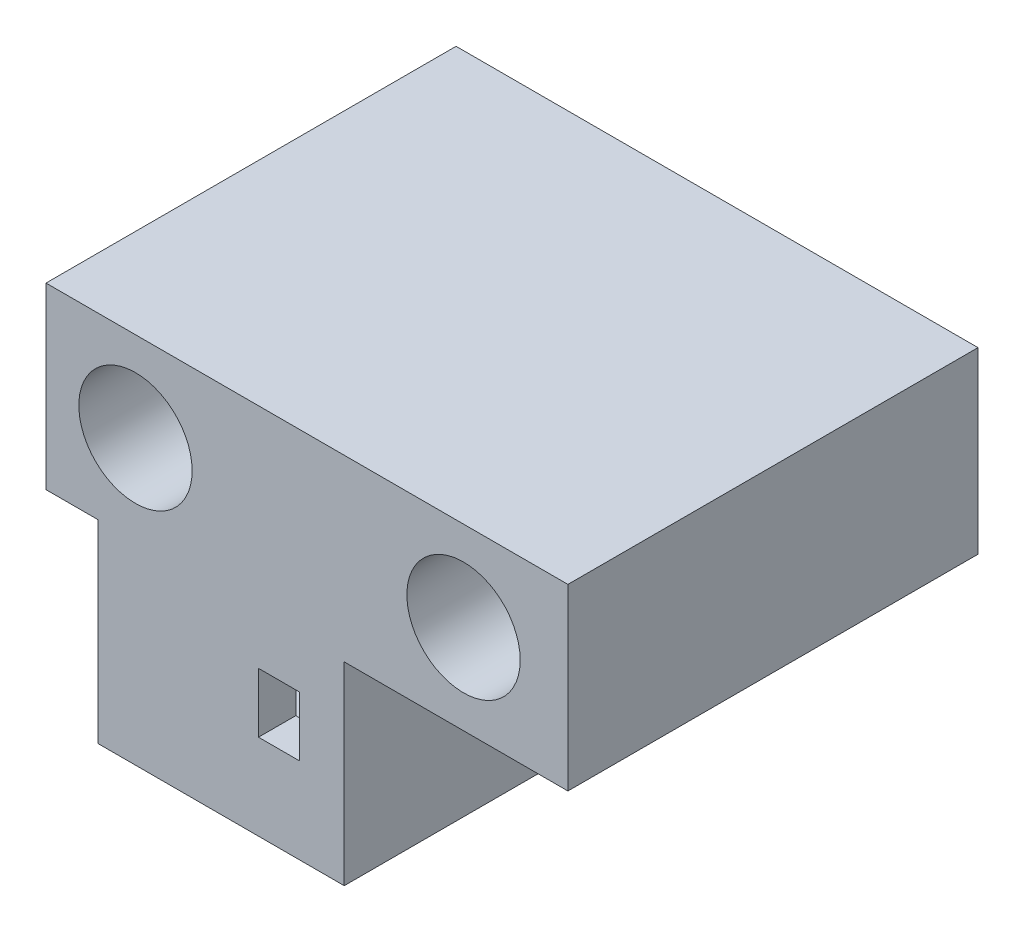
ISO-10303-21;
HEADER;
FILE_DESCRIPTION(('STEP AP214'),'2;1');
FILE_NAME('part.step','',(''),(''),'','','');
FILE_SCHEMA(('AUTOMOTIVE_DESIGN { 1 0 10303 214 1 1 1 1 }'));
ENDSEC;
DATA;
#1=APPLICATION_CONTEXT('core data for automotive mechanical design processes');
#2=APPLICATION_PROTOCOL_DEFINITION('international standard','automotive_design',2000,#1);
#3=PRODUCT_CONTEXT('',#1,'mechanical');
#4=PRODUCT('Part','Part','',(#3));
#5=PRODUCT_RELATED_PRODUCT_CATEGORY('part','',(#4));
#6=PRODUCT_DEFINITION_FORMATION('','',#4);
#7=PRODUCT_DEFINITION_CONTEXT('part definition',#1,'design');
#8=PRODUCT_DEFINITION('design','',#6,#7);
#9=PRODUCT_DEFINITION_SHAPE('','',#8);
#10=(LENGTH_UNIT() NAMED_UNIT(*) SI_UNIT(.MILLI.,.METRE.));
#11=(NAMED_UNIT(*) PLANE_ANGLE_UNIT() SI_UNIT($,.RADIAN.));
#12=(NAMED_UNIT(*) SI_UNIT($,.STERADIAN.) SOLID_ANGLE_UNIT());
#13=UNCERTAINTY_MEASURE_WITH_UNIT(LENGTH_MEASURE(1.E-05),#10,'distance_accuracy_value','');
#14=(GEOMETRIC_REPRESENTATION_CONTEXT(3) GLOBAL_UNCERTAINTY_ASSIGNED_CONTEXT((#13)) GLOBAL_UNIT_ASSIGNED_CONTEXT((#10,
#11,#12)) REPRESENTATION_CONTEXT('',''));
#15=CARTESIAN_POINT('',(0.,0.,0.));
#16=DIRECTION('',(0.,0.,1.));
#17=DIRECTION('',(1.,0.,0.));
#18=AXIS2_PLACEMENT_3D('',#15,#16,#17);
#19=CARTESIAN_POINT('',(0.,0.,55.));
#20=DIRECTION('',(0.,1.,0.));
#21=DIRECTION('',(0.,0.,1.));
#22=AXIS2_PLACEMENT_3D('',#19,#20,#21);
#23=PLANE('',#22);
#24=DIRECTION('',(0.,0.,-1.));
#25=VECTOR('',#24,1.);
#26=CARTESIAN_POINT('',(7.,0.,0.));
#27=LINE('',#26,#25);
#28=CARTESIAN_POINT('',(7.,0.,5.));
#29=VERTEX_POINT('',#28);
#30=CARTESIAN_POINT('',(7.,0.,0.));
#31=VERTEX_POINT('',#30);
#32=EDGE_CURVE('E211',#29,#31,#27,.T.);
#33=ORIENTED_EDGE('',*,*,#32,.F.);
#34=DIRECTION('',(-1.,0.,0.));
#35=VECTOR('',#34,1.);
#36=CARTESIAN_POINT('',(7.,0.,5.));
#37=LINE('',#36,#35);
#38=CARTESIAN_POINT('',(35.,0.,5.));
#39=VERTEX_POINT('',#38);
#40=EDGE_CURVE('E218',#39,#29,#37,.T.);
#41=ORIENTED_EDGE('',*,*,#40,.F.);
#42=DIRECTION('',(0.,0.,-1.));
#43=VECTOR('',#42,1.);
#44=CARTESIAN_POINT('',(35.,0.,5.));
#45=LINE('',#44,#43);
#46=CARTESIAN_POINT('',(35.,0.,50.));
#47=VERTEX_POINT('',#46);
#48=EDGE_CURVE('E236',#47,#39,#45,.T.);
#49=ORIENTED_EDGE('',*,*,#48,.F.);
#50=DIRECTION('',(1.,0.,0.));
#51=VECTOR('',#50,1.);
#52=CARTESIAN_POINT('',(7.,0.,50.));
#53=LINE('',#52,#51);
#54=CARTESIAN_POINT('',(7.,0.,50.));
#55=VERTEX_POINT('',#54);
#56=EDGE_CURVE('E233',#55,#47,#53,.T.);
#57=ORIENTED_EDGE('',*,*,#56,.F.);
#58=DIRECTION('',(0.,0.,-1.));
#59=VECTOR('',#58,1.);
#60=CARTESIAN_POINT('',(7.,0.,55.));
#61=LINE('',#60,#59);
#62=CARTESIAN_POINT('',(7.,0.,55.));
#63=VERTEX_POINT('',#62);
#64=EDGE_CURVE('E230',#63,#55,#61,.T.);
#65=ORIENTED_EDGE('',*,*,#64,.F.);
#66=DIRECTION('',(1.,0.,0.));
#67=VECTOR('',#66,1.);
#68=CARTESIAN_POINT('',(0.,0.,55.));
#69=LINE('',#68,#67);
#70=CARTESIAN_POINT('',(0.,0.,55.));
#71=VERTEX_POINT('',#70);
#72=EDGE_CURVE('E282',#71,#63,#69,.T.);
#73=ORIENTED_EDGE('',*,*,#72,.F.);
#74=DIRECTION('',(0.,0.,-1.));
#75=VECTOR('',#74,1.);
#76=CARTESIAN_POINT('',(0.,0.,55.));
#77=LINE('',#76,#75);
#78=CARTESIAN_POINT('',(0.,0.,0.));
#79=VERTEX_POINT('',#78);
#80=EDGE_CURVE('E306',#71,#79,#77,.T.);
#81=ORIENTED_EDGE('',*,*,#80,.T.);
#82=DIRECTION('',(1.,0.,0.));
#83=VECTOR('',#82,1.);
#84=CARTESIAN_POINT('',(0.,0.,0.));
#85=LINE('',#84,#83);
#86=EDGE_CURVE('E293',#79,#31,#85,.T.);
#87=ORIENTED_EDGE('',*,*,#86,.T.);
#88=EDGE_LOOP('',(#33,#41,#49,#57,#65,#73,#81,#87));
#89=FACE_BOUND('',#88,.T.);
#90=ADVANCED_FACE('F33',(#89),#23,.F.);
#91=DIRECTION('',(0.,0.,1.));
#92=VECTOR('',#91,1.);
#93=CARTESIAN_POINT('',(40.,0.,0.));
#94=LINE('',#93,#92);
#95=CARTESIAN_POINT('',(40.,0.,0.));
#96=VERTEX_POINT('',#95);
#97=CARTESIAN_POINT('',(40.,0.,55.));
#98=VERTEX_POINT('',#97);
#99=EDGE_CURVE('E227',#96,#98,#94,.T.);
#100=ORIENTED_EDGE('',*,*,#99,.F.);
#101=CARTESIAN_POINT('',(70.,0.,0.));
#102=VERTEX_POINT('',#101);
#103=EDGE_CURVE('E292',#96,#102,#85,.T.);
#104=ORIENTED_EDGE('',*,*,#103,.T.);
#105=DIRECTION('',(0.,0.,-1.));
#106=VECTOR('',#105,1.);
#107=CARTESIAN_POINT('',(70.,0.,55.));
#108=LINE('',#107,#106);
#109=CARTESIAN_POINT('',(70.,0.,55.));
#110=VERTEX_POINT('',#109);
#111=EDGE_CURVE('E303',#110,#102,#108,.T.);
#112=ORIENTED_EDGE('',*,*,#111,.F.);
#113=EDGE_CURVE('E280',#98,#110,#69,.T.);
#114=ORIENTED_EDGE('',*,*,#113,.F.);
#115=EDGE_LOOP('',(#100,#104,#112,#114));
#116=FACE_BOUND('',#115,.T.);
#117=ADVANCED_FACE('F332',(#116),#23,.F.);
#118=CARTESIAN_POINT('',(0.,0.,55.));
#119=DIRECTION('',(1.,0.,0.));
#120=DIRECTION('',(0.,0.,-1.));
#121=AXIS2_PLACEMENT_3D('',#118,#119,#120);
#122=PLANE('',#121);
#123=DIRECTION('',(0.,-1.,0.));
#124=VECTOR('',#123,1.);
#125=CARTESIAN_POINT('',(0.,0.,0.));
#126=LINE('',#125,#124);
#127=CARTESIAN_POINT('',(0.,24.,0.));
#128=VERTEX_POINT('',#127);
#129=EDGE_CURVE('E274',#128,#79,#126,.T.);
#130=ORIENTED_EDGE('',*,*,#129,.T.);
#131=ORIENTED_EDGE('',*,*,#80,.F.);
#132=DIRECTION('',(0.,-1.,0.));
#133=VECTOR('',#132,1.);
#134=CARTESIAN_POINT('',(0.,0.,55.));
#135=LINE('',#134,#133);
#136=CARTESIAN_POINT('',(0.,24.,55.));
#137=VERTEX_POINT('',#136);
#138=EDGE_CURVE('E277',#137,#71,#135,.T.);
#139=ORIENTED_EDGE('',*,*,#138,.F.);
#140=DIRECTION('',(0.,0.,-1.));
#141=VECTOR('',#140,1.);
#142=CARTESIAN_POINT('',(0.,24.,55.));
#143=LINE('',#142,#141);
#144=EDGE_CURVE('E289',#137,#128,#143,.T.);
#145=ORIENTED_EDGE('',*,*,#144,.T.);
#146=EDGE_LOOP('',(#130,#131,#139,#145));
#147=FACE_BOUND('',#146,.T.);
#148=ADVANCED_FACE('F35',(#147),#122,.F.);
#149=CARTESIAN_POINT('',(70.,0.,55.));
#150=DIRECTION('',(-1.,0.,0.));
#151=DIRECTION('',(0.,0.,1.));
#152=AXIS2_PLACEMENT_3D('',#149,#150,#151);
#153=PLANE('',#152);
#154=DIRECTION('',(0.,1.,0.));
#155=VECTOR('',#154,1.);
#156=CARTESIAN_POINT('',(70.,0.,0.));
#157=LINE('',#156,#155);
#158=CARTESIAN_POINT('',(70.,24.,0.));
#159=VERTEX_POINT('',#158);
#160=EDGE_CURVE('E295',#102,#159,#157,.T.);
#161=ORIENTED_EDGE('',*,*,#160,.T.);
#162=DIRECTION('',(0.,0.,-1.));
#163=VECTOR('',#162,1.);
#164=CARTESIAN_POINT('',(70.,24.,55.));
#165=LINE('',#164,#163);
#166=CARTESIAN_POINT('',(70.,24.,55.));
#167=VERTEX_POINT('',#166);
#168=EDGE_CURVE('E300',#167,#159,#165,.T.);
#169=ORIENTED_EDGE('',*,*,#168,.F.);
#170=DIRECTION('',(0.,1.,0.));
#171=VECTOR('',#170,1.);
#172=CARTESIAN_POINT('',(70.,0.,55.));
#173=LINE('',#172,#171);
#174=EDGE_CURVE('E285',#110,#167,#173,.T.);
#175=ORIENTED_EDGE('',*,*,#174,.F.);
#176=ORIENTED_EDGE('',*,*,#111,.T.);
#177=EDGE_LOOP('',(#161,#169,#175,#176));
#178=FACE_BOUND('',#177,.T.);
#179=ADVANCED_FACE('F339',(#178),#153,.F.);
#180=CARTESIAN_POINT('',(0.,24.,55.));
#181=DIRECTION('',(0.,-1.,0.));
#182=DIRECTION('',(0.,0.,-1.));
#183=AXIS2_PLACEMENT_3D('',#180,#181,#182);
#184=PLANE('',#183);
#185=DIRECTION('',(-1.,0.,0.));
#186=VECTOR('',#185,1.);
#187=CARTESIAN_POINT('',(0.,24.,0.));
#188=LINE('',#187,#186);
#189=EDGE_CURVE('E281',#159,#128,#188,.T.);
#190=ORIENTED_EDGE('',*,*,#189,.T.);
#191=ORIENTED_EDGE('',*,*,#144,.F.);
#192=DIRECTION('',(-1.,0.,0.));
#193=VECTOR('',#192,1.);
#194=CARTESIAN_POINT('',(0.,24.,55.));
#195=LINE('',#194,#193);
#196=EDGE_CURVE('E287',#167,#137,#195,.T.);
#197=ORIENTED_EDGE('',*,*,#196,.F.);
#198=ORIENTED_EDGE('',*,*,#168,.T.);
#199=EDGE_LOOP('',(#190,#191,#197,#198));
#200=FACE_BOUND('',#199,.T.);
#201=ADVANCED_FACE('F342',(#200),#184,.F.);
#202=CARTESIAN_POINT('',(0.,0.,55.));
#203=DIRECTION('',(0.,0.,-1.));
#204=DIRECTION('',(-1.,0.,0.));
#205=AXIS2_PLACEMENT_3D('',#202,#203,#204);
#206=PLANE('',#205);
#207=DIRECTION('',(1.,0.,0.));
#208=VECTOR('',#207,1.);
#209=CARTESIAN_POINT('',(28.5,-14.5,55.));
#210=LINE('',#209,#208);
#211=CARTESIAN_POINT('',(28.5,-14.5,55.));
#212=VERTEX_POINT('',#211);
#213=CARTESIAN_POINT('',(34.,-14.5,55.));
#214=VERTEX_POINT('',#213);
#215=EDGE_CURVE('E158',#212,#214,#210,.T.);
#216=ORIENTED_EDGE('',*,*,#215,.F.);
#217=DIRECTION('',(0.,-1.,0.));
#218=VECTOR('',#217,1.);
#219=CARTESIAN_POINT('',(28.5,-14.5,55.));
#220=LINE('',#219,#218);
#221=CARTESIAN_POINT('',(28.5,-6.5,55.));
#222=VERTEX_POINT('',#221);
#223=EDGE_CURVE('E48',#222,#212,#220,.T.);
#224=ORIENTED_EDGE('',*,*,#223,.F.);
#225=DIRECTION('',(-1.,0.,0.));
#226=VECTOR('',#225,1.);
#227=CARTESIAN_POINT('',(28.5,-6.5,55.));
#228=LINE('',#227,#226);
#229=CARTESIAN_POINT('',(34.,-6.5,55.));
#230=VERTEX_POINT('',#229);
#231=EDGE_CURVE('E165',#230,#222,#228,.T.);
#232=ORIENTED_EDGE('',*,*,#231,.F.);
#233=DIRECTION('',(0.,1.,0.));
#234=VECTOR('',#233,1.);
#235=CARTESIAN_POINT('',(34.,-14.5,55.));
#236=LINE('',#235,#234);
#237=EDGE_CURVE('E149',#214,#230,#236,.T.);
#238=ORIENTED_EDGE('',*,*,#237,.F.);
#239=EDGE_LOOP('',(#216,#224,#232,#238));
#240=FACE_BOUND('',#239,.T.);
#241=CARTESIAN_POINT('',(12.,12.,55.));
#242=DIRECTION('',(0.,0.,1.));
#243=DIRECTION('',(1.,0.,0.));
#244=AXIS2_PLACEMENT_3D('',#241,#242,#243);
#245=CIRCLE('',#244,7.6);
#246=CARTESIAN_POINT('',(19.6,12.,55.));
#247=VERTEX_POINT('',#246);
#248=EDGE_CURVE('E265',#247,#247,#245,.T.);
#249=ORIENTED_EDGE('',*,*,#248,.F.);
#250=EDGE_LOOP('',(#249));
#251=FACE_BOUND('',#250,.T.);
#252=CARTESIAN_POINT('',(56.,12.,55.));
#253=DIRECTION('',(0.,0.,1.));
#254=DIRECTION('',(1.,0.,0.));
#255=AXIS2_PLACEMENT_3D('',#252,#253,#254);
#256=CIRCLE('',#255,7.59999999999999);
#257=CARTESIAN_POINT('',(63.6,12.,55.));
#258=VERTEX_POINT('',#257);
#259=EDGE_CURVE('E271',#258,#258,#256,.T.);
#260=ORIENTED_EDGE('',*,*,#259,.F.);
#261=EDGE_LOOP('',(#260));
#262=FACE_BOUND('',#261,.T.);
#263=ORIENTED_EDGE('',*,*,#138,.T.);
#264=ORIENTED_EDGE('',*,*,#72,.T.);
#265=DIRECTION('',(0.,1.,0.));
#266=VECTOR('',#265,1.);
#267=CARTESIAN_POINT('',(7.,-21.,55.));
#268=LINE('',#267,#266);
#269=CARTESIAN_POINT('',(7.,-26.,55.));
#270=VERTEX_POINT('',#269);
#271=EDGE_CURVE('E252',#270,#63,#268,.T.);
#272=ORIENTED_EDGE('',*,*,#271,.F.);
#273=DIRECTION('',(-1.,0.,0.));
#274=VECTOR('',#273,1.);
#275=CARTESIAN_POINT('',(40.,-26.,55.));
#276=LINE('',#275,#274);
#277=CARTESIAN_POINT('',(40.,-26.,55.));
#278=VERTEX_POINT('',#277);
#279=EDGE_CURVE('E202',#278,#270,#276,.T.);
#280=ORIENTED_EDGE('',*,*,#279,.F.);
#281=DIRECTION('',(0.,1.,0.));
#282=VECTOR('',#281,1.);
#283=CARTESIAN_POINT('',(40.,-21.,55.));
#284=LINE('',#283,#282);
#285=EDGE_CURVE('E255',#278,#98,#284,.T.);
#286=ORIENTED_EDGE('',*,*,#285,.T.);
#287=ORIENTED_EDGE('',*,*,#113,.T.);
#288=ORIENTED_EDGE('',*,*,#174,.T.);
#289=ORIENTED_EDGE('',*,*,#196,.T.);
#290=EDGE_LOOP('',(#263,#264,#272,#280,#286,#287,#288,#289));
#291=FACE_BOUND('',#290,.T.);
#292=ADVANCED_FACE('F162',(#240,#251,#262,#291),#206,.F.);
#293=CARTESIAN_POINT('',(0.,0.,0.));
#294=DIRECTION('',(0.,0.,-1.));
#295=DIRECTION('',(-1.,0.,0.));
#296=AXIS2_PLACEMENT_3D('',#293,#294,#295);
#297=PLANE('',#296);
#298=CARTESIAN_POINT('',(12.,12.,0.));
#299=DIRECTION('',(0.,0.,1.));
#300=DIRECTION('',(1.,0.,0.));
#301=AXIS2_PLACEMENT_3D('',#298,#299,#300);
#302=CIRCLE('',#301,7.6);
#303=CARTESIAN_POINT('',(19.6,12.,0.));
#304=VERTEX_POINT('',#303);
#305=EDGE_CURVE('E264',#304,#304,#302,.T.);
#306=ORIENTED_EDGE('',*,*,#305,.T.);
#307=EDGE_LOOP('',(#306));
#308=FACE_BOUND('',#307,.T.);
#309=CARTESIAN_POINT('',(56.,12.,0.));
#310=DIRECTION('',(0.,0.,1.));
#311=DIRECTION('',(1.,0.,0.));
#312=AXIS2_PLACEMENT_3D('',#309,#310,#311);
#313=CIRCLE('',#312,7.59999999999999);
#314=CARTESIAN_POINT('',(63.6,12.,0.));
#315=VERTEX_POINT('',#314);
#316=EDGE_CURVE('E268',#315,#315,#313,.T.);
#317=ORIENTED_EDGE('',*,*,#316,.T.);
#318=EDGE_LOOP('',(#317));
#319=FACE_BOUND('',#318,.T.);
#320=ORIENTED_EDGE('',*,*,#129,.F.);
#321=ORIENTED_EDGE('',*,*,#189,.F.);
#322=ORIENTED_EDGE('',*,*,#160,.F.);
#323=ORIENTED_EDGE('',*,*,#103,.F.);
#324=DIRECTION('',(0.,1.,0.));
#325=VECTOR('',#324,1.);
#326=CARTESIAN_POINT('',(40.,-21.,0.));
#327=LINE('',#326,#325);
#328=CARTESIAN_POINT('',(40.,-26.,0.));
#329=VERTEX_POINT('',#328);
#330=EDGE_CURVE('E258',#329,#96,#327,.T.);
#331=ORIENTED_EDGE('',*,*,#330,.F.);
#332=DIRECTION('',(1.,0.,0.));
#333=VECTOR('',#332,1.);
#334=CARTESIAN_POINT('',(40.,-26.,0.));
#335=LINE('',#334,#333);
#336=CARTESIAN_POINT('',(7.,-26.,0.));
#337=VERTEX_POINT('',#336);
#338=EDGE_CURVE('E208',#337,#329,#335,.T.);
#339=ORIENTED_EDGE('',*,*,#338,.F.);
#340=DIRECTION('',(0.,1.,0.));
#341=VECTOR('',#340,1.);
#342=CARTESIAN_POINT('',(7.,-21.,0.));
#343=LINE('',#342,#341);
#344=EDGE_CURVE('E261',#337,#31,#343,.T.);
#345=ORIENTED_EDGE('',*,*,#344,.T.);
#346=ORIENTED_EDGE('',*,*,#86,.F.);
#347=EDGE_LOOP('',(#320,#321,#322,#323,#331,#339,#345,#346));
#348=FACE_BOUND('',#347,.T.);
#349=ADVANCED_FACE('F347',(#308,#319,#348),#297,.T.);
#350=CARTESIAN_POINT('',(56.,12.,55.));
#351=DIRECTION('',(0.,0.,-1.));
#352=DIRECTION('',(-1.,0.,0.));
#353=AXIS2_PLACEMENT_3D('',#350,#351,#352);
#354=CYLINDRICAL_SURFACE('',#353,7.59999999999999);
#355=ORIENTED_EDGE('',*,*,#259,.T.);
#356=EDGE_LOOP('',(#355));
#357=FACE_BOUND('',#356,.T.);
#358=ORIENTED_EDGE('',*,*,#316,.F.);
#359=EDGE_LOOP('',(#358));
#360=FACE_BOUND('',#359,.T.);
#361=ADVANCED_FACE('F350',(#357,#360),#354,.F.);
#362=CARTESIAN_POINT('',(12.,12.,55.));
#363=DIRECTION('',(0.,0.,-1.));
#364=DIRECTION('',(-1.,0.,0.));
#365=AXIS2_PLACEMENT_3D('',#362,#363,#364);
#366=CYLINDRICAL_SURFACE('',#365,7.6);
#367=ORIENTED_EDGE('',*,*,#248,.T.);
#368=EDGE_LOOP('',(#367));
#369=FACE_BOUND('',#368,.T.);
#370=ORIENTED_EDGE('',*,*,#305,.F.);
#371=EDGE_LOOP('',(#370));
#372=FACE_BOUND('',#371,.T.);
#373=ADVANCED_FACE('F356',(#369,#372),#366,.F.);
#374=CARTESIAN_POINT('',(7.,-21.,0.));
#375=DIRECTION('',(1.,0.,0.));
#376=DIRECTION('',(0.,0.,-1.));
#377=AXIS2_PLACEMENT_3D('',#374,#375,#376);
#378=PLANE('',#377);
#379=CARTESIAN_POINT('',(7.,-5.,52.5));
#380=DIRECTION('',(-1.,0.,0.));
#381=DIRECTION('',(0.,0.,1.));
#382=AXIS2_PLACEMENT_3D('',#379,#380,#381);
#383=CIRCLE('',#382,1.5);
#384=CARTESIAN_POINT('',(7.,-5.,54.));
#385=VERTEX_POINT('',#384);
#386=EDGE_CURVE('E179',#385,#385,#383,.T.);
#387=ORIENTED_EDGE('',*,*,#386,.F.);
#388=EDGE_LOOP('',(#387));
#389=FACE_BOUND('',#388,.T.);
#390=CARTESIAN_POINT('',(7.,-16.,2.5));
#391=DIRECTION('',(-1.,0.,0.));
#392=DIRECTION('',(0.,0.,1.));
#393=AXIS2_PLACEMENT_3D('',#390,#391,#392);
#394=CIRCLE('',#393,1.5);
#395=CARTESIAN_POINT('',(7.,-16.,4.));
#396=VERTEX_POINT('',#395);
#397=EDGE_CURVE('E185',#396,#396,#394,.T.);
#398=ORIENTED_EDGE('',*,*,#397,.F.);
#399=EDGE_LOOP('',(#398));
#400=FACE_BOUND('',#399,.T.);
#401=CARTESIAN_POINT('',(7.,-5.,2.5));
#402=DIRECTION('',(-1.,0.,0.));
#403=DIRECTION('',(0.,0.,1.));
#404=AXIS2_PLACEMENT_3D('',#401,#402,#403);
#405=CIRCLE('',#404,1.5);
#406=CARTESIAN_POINT('',(7.,-5.,4.));
#407=VERTEX_POINT('',#406);
#408=EDGE_CURVE('E172',#407,#407,#405,.T.);
#409=ORIENTED_EDGE('',*,*,#408,.F.);
#410=EDGE_LOOP('',(#409));
#411=FACE_BOUND('',#410,.T.);
#412=CARTESIAN_POINT('',(7.,-16.,52.5));
#413=DIRECTION('',(-1.,0.,0.));
#414=DIRECTION('',(0.,0.,1.));
#415=AXIS2_PLACEMENT_3D('',#412,#413,#414);
#416=CIRCLE('',#415,1.5);
#417=CARTESIAN_POINT('',(7.,-16.,54.));
#418=VERTEX_POINT('',#417);
#419=EDGE_CURVE('E178',#418,#418,#416,.T.);
#420=ORIENTED_EDGE('',*,*,#419,.F.);
#421=EDGE_LOOP('',(#420));
#422=FACE_BOUND('',#421,.T.);
#423=ORIENTED_EDGE('',*,*,#32,.T.);
#424=ORIENTED_EDGE('',*,*,#344,.F.);
#425=DIRECTION('',(0.,0.,-1.));
#426=VECTOR('',#425,1.);
#427=CARTESIAN_POINT('',(7.,-26.,55.));
#428=LINE('',#427,#426);
#429=EDGE_CURVE('E205',#270,#337,#428,.T.);
#430=ORIENTED_EDGE('',*,*,#429,.F.);
#431=ORIENTED_EDGE('',*,*,#271,.T.);
#432=ORIENTED_EDGE('',*,*,#64,.T.);
#433=DIRECTION('',(0.,1.,0.));
#434=VECTOR('',#433,1.);
#435=CARTESIAN_POINT('',(7.,-21.,50.));
#436=LINE('',#435,#434);
#437=CARTESIAN_POINT('',(7.,-21.,50.));
#438=VERTEX_POINT('',#437);
#439=EDGE_CURVE('E249',#438,#55,#436,.T.);
#440=ORIENTED_EDGE('',*,*,#439,.F.);
#441=DIRECTION('',(0.,0.,-1.));
#442=VECTOR('',#441,1.);
#443=CARTESIAN_POINT('',(7.,-21.,55.));
#444=LINE('',#443,#442);
#445=CARTESIAN_POINT('',(7.,-21.,5.));
#446=VERTEX_POINT('',#445);
#447=EDGE_CURVE('E196',#438,#446,#444,.T.);
#448=ORIENTED_EDGE('',*,*,#447,.T.);
#449=DIRECTION('',(0.,1.,0.));
#450=VECTOR('',#449,1.);
#451=CARTESIAN_POINT('',(7.,-21.,5.));
#452=LINE('',#451,#450);
#453=EDGE_CURVE('E224',#446,#29,#452,.T.);
#454=ORIENTED_EDGE('',*,*,#453,.T.);
#455=EDGE_LOOP('',(#423,#424,#430,#431,#432,#440,#448,#454));
#456=FACE_BOUND('',#455,.T.);
#457=ADVANCED_FACE('F360',(#389,#400,#411,#422,#456),#378,.F.);
#458=CARTESIAN_POINT('',(40.,-21.,0.));
#459=DIRECTION('',(-1.,0.,0.));
#460=DIRECTION('',(0.,0.,1.));
#461=AXIS2_PLACEMENT_3D('',#458,#459,#460);
#462=PLANE('',#461);
#463=ORIENTED_EDGE('',*,*,#99,.T.);
#464=ORIENTED_EDGE('',*,*,#285,.F.);
#465=DIRECTION('',(0.,0.,1.));
#466=VECTOR('',#465,1.);
#467=CARTESIAN_POINT('',(40.,-26.,55.));
#468=LINE('',#467,#466);
#469=EDGE_CURVE('E199',#329,#278,#468,.T.);
#470=ORIENTED_EDGE('',*,*,#469,.F.);
#471=ORIENTED_EDGE('',*,*,#330,.T.);
#472=EDGE_LOOP('',(#463,#464,#470,#471));
#473=FACE_BOUND('',#472,.T.);
#474=ADVANCED_FACE('F364',(#473),#462,.F.);
#475=CARTESIAN_POINT('',(7.,-21.,50.));
#476=DIRECTION('',(0.,0.,1.));
#477=DIRECTION('',(1.,0.,0.));
#478=AXIS2_PLACEMENT_3D('',#475,#476,#477);
#479=PLANE('',#478);
#480=DIRECTION('',(-1.,0.,0.));
#481=VECTOR('',#480,1.);
#482=CARTESIAN_POINT('',(6.99999999999999,-6.50000000000002,50.));
#483=LINE('',#482,#481);
#484=CARTESIAN_POINT('',(34.,-6.5,50.));
#485=VERTEX_POINT('',#484);
#486=CARTESIAN_POINT('',(28.5,-6.5,50.));
#487=VERTEX_POINT('',#486);
#488=EDGE_CURVE('E41',#485,#487,#483,.T.);
#489=ORIENTED_EDGE('',*,*,#488,.T.);
#490=DIRECTION('',(0.,-1.,0.));
#491=VECTOR('',#490,1.);
#492=CARTESIAN_POINT('',(28.5,-21.,50.));
#493=LINE('',#492,#491);
#494=CARTESIAN_POINT('',(28.5,-14.5,50.));
#495=VERTEX_POINT('',#494);
#496=EDGE_CURVE('E11',#487,#495,#493,.T.);
#497=ORIENTED_EDGE('',*,*,#496,.T.);
#498=DIRECTION('',(1.,0.,0.));
#499=VECTOR('',#498,1.);
#500=CARTESIAN_POINT('',(7.,-14.5,50.));
#501=LINE('',#500,#499);
#502=CARTESIAN_POINT('',(34.,-14.5,50.));
#503=VERTEX_POINT('',#502);
#504=EDGE_CURVE('E309',#495,#503,#501,.T.);
#505=ORIENTED_EDGE('',*,*,#504,.T.);
#506=DIRECTION('',(0.,1.,0.));
#507=VECTOR('',#506,1.);
#508=CARTESIAN_POINT('',(34.,-21.,50.));
#509=LINE('',#508,#507);
#510=EDGE_CURVE('E152',#503,#485,#509,.T.);
#511=ORIENTED_EDGE('',*,*,#510,.T.);
#512=EDGE_LOOP('',(#489,#497,#505,#511));
#513=FACE_BOUND('',#512,.T.);
#514=ORIENTED_EDGE('',*,*,#56,.T.);
#515=DIRECTION('',(0.,1.,0.));
#516=VECTOR('',#515,1.);
#517=CARTESIAN_POINT('',(35.,-21.,50.));
#518=LINE('',#517,#516);
#519=CARTESIAN_POINT('',(35.,-21.,50.));
#520=VERTEX_POINT('',#519);
#521=EDGE_CURVE('E246',#520,#47,#518,.T.);
#522=ORIENTED_EDGE('',*,*,#521,.F.);
#523=DIRECTION('',(1.,0.,0.));
#524=VECTOR('',#523,1.);
#525=CARTESIAN_POINT('',(7.,-21.,50.));
#526=LINE('',#525,#524);
#527=EDGE_CURVE('E214',#438,#520,#526,.T.);
#528=ORIENTED_EDGE('',*,*,#527,.F.);
#529=ORIENTED_EDGE('',*,*,#439,.T.);
#530=EDGE_LOOP('',(#514,#522,#528,#529));
#531=FACE_BOUND('',#530,.T.);
#532=ADVANCED_FACE('F313',(#513,#531),#479,.F.);
#533=CARTESIAN_POINT('',(35.,-21.,5.));
#534=DIRECTION('',(1.,0.,0.));
#535=DIRECTION('',(0.,0.,-1.));
#536=AXIS2_PLACEMENT_3D('',#533,#534,#535);
#537=PLANE('',#536);
#538=ORIENTED_EDGE('',*,*,#48,.T.);
#539=DIRECTION('',(0.,1.,0.));
#540=VECTOR('',#539,1.);
#541=CARTESIAN_POINT('',(35.,-21.,5.));
#542=LINE('',#541,#540);
#543=CARTESIAN_POINT('',(35.,-21.,5.));
#544=VERTEX_POINT('',#543);
#545=EDGE_CURVE('E243',#544,#39,#542,.T.);
#546=ORIENTED_EDGE('',*,*,#545,.F.);
#547=DIRECTION('',(0.,0.,-1.));
#548=VECTOR('',#547,1.);
#549=CARTESIAN_POINT('',(35.,-21.,5.));
#550=LINE('',#549,#548);
#551=EDGE_CURVE('E217',#520,#544,#550,.T.);
#552=ORIENTED_EDGE('',*,*,#551,.F.);
#553=ORIENTED_EDGE('',*,*,#521,.T.);
#554=EDGE_LOOP('',(#538,#546,#552,#553));
#555=FACE_BOUND('',#554,.T.);
#556=ADVANCED_FACE('F371',(#555),#537,.F.);
#557=CARTESIAN_POINT('',(7.,-21.,5.));
#558=DIRECTION('',(0.,0.,-1.));
#559=DIRECTION('',(-1.,0.,0.));
#560=AXIS2_PLACEMENT_3D('',#557,#558,#559);
#561=PLANE('',#560);
#562=ORIENTED_EDGE('',*,*,#40,.T.);
#563=ORIENTED_EDGE('',*,*,#453,.F.);
#564=DIRECTION('',(-1.,0.,0.));
#565=VECTOR('',#564,1.);
#566=CARTESIAN_POINT('',(7.,-21.,5.));
#567=LINE('',#566,#565);
#568=EDGE_CURVE('E221',#544,#446,#567,.T.);
#569=ORIENTED_EDGE('',*,*,#568,.F.);
#570=ORIENTED_EDGE('',*,*,#545,.T.);
#571=EDGE_LOOP('',(#562,#563,#569,#570));
#572=FACE_BOUND('',#571,.T.);
#573=ADVANCED_FACE('F374',(#572),#561,.F.);
#574=CARTESIAN_POINT('',(0.,-26.,0.));
#575=DIRECTION('',(0.,1.,0.));
#576=DIRECTION('',(0.,0.,1.));
#577=AXIS2_PLACEMENT_3D('',#574,#575,#576);
#578=PLANE('',#577);
#579=ORIENTED_EDGE('',*,*,#469,.T.);
#580=ORIENTED_EDGE('',*,*,#279,.T.);
#581=ORIENTED_EDGE('',*,*,#429,.T.);
#582=ORIENTED_EDGE('',*,*,#338,.T.);
#583=EDGE_LOOP('',(#579,#580,#581,#582));
#584=FACE_BOUND('',#583,.T.);
#585=ADVANCED_FACE('F378',(#584),#578,.F.);
#586=CARTESIAN_POINT('',(0.,-21.,0.));
#587=DIRECTION('',(0.,1.,0.));
#588=DIRECTION('',(0.,0.,1.));
#589=AXIS2_PLACEMENT_3D('',#586,#587,#588);
#590=PLANE('',#589);
#591=ORIENTED_EDGE('',*,*,#447,.F.);
#592=ORIENTED_EDGE('',*,*,#527,.T.);
#593=ORIENTED_EDGE('',*,*,#551,.T.);
#594=ORIENTED_EDGE('',*,*,#568,.T.);
#595=EDGE_LOOP('',(#591,#592,#593,#594));
#596=FACE_BOUND('',#595,.T.);
#597=ADVANCED_FACE('F380',(#596),#590,.T.);
#598=CARTESIAN_POINT('',(11.,-16.,52.5));
#599=DIRECTION('',(-1.,0.,0.));
#600=DIRECTION('',(0.,0.,1.));
#601=AXIS2_PLACEMENT_3D('',#598,#599,#600);
#602=CYLINDRICAL_SURFACE('',#601,1.5);
#603=CARTESIAN_POINT('',(11.,-16.,52.5));
#604=DIRECTION('',(-1.,0.,0.));
#605=DIRECTION('',(0.,0.,1.));
#606=AXIS2_PLACEMENT_3D('',#603,#604,#605);
#607=CIRCLE('',#606,1.5);
#608=CARTESIAN_POINT('',(11.,-16.,54.));
#609=VERTEX_POINT('',#608);
#610=EDGE_CURVE('E193',#609,#609,#607,.T.);
#611=ORIENTED_EDGE('',*,*,#610,.F.);
#612=EDGE_LOOP('',(#611));
#613=FACE_BOUND('',#612,.T.);
#614=ORIENTED_EDGE('',*,*,#419,.T.);
#615=EDGE_LOOP('',(#614));
#616=FACE_BOUND('',#615,.T.);
#617=ADVANCED_FACE('F383',(#613,#616),#602,.F.);
#618=CARTESIAN_POINT('',(11.,-16.,52.5));
#619=DIRECTION('',(-1.,0.,0.));
#620=DIRECTION('',(0.,0.,1.));
#621=AXIS2_PLACEMENT_3D('',#618,#619,#620);
#622=PLANE('',#621);
#623=ORIENTED_EDGE('',*,*,#610,.T.);
#624=EDGE_LOOP('',(#623));
#625=FACE_BOUND('',#624,.T.);
#626=ADVANCED_FACE('F390',(#625),#622,.T.);
#627=CARTESIAN_POINT('',(11.,-5.,2.5));
#628=DIRECTION('',(-1.,0.,0.));
#629=DIRECTION('',(0.,0.,1.));
#630=AXIS2_PLACEMENT_3D('',#627,#628,#629);
#631=CYLINDRICAL_SURFACE('',#630,1.5);
#632=CARTESIAN_POINT('',(11.,-5.,2.5));
#633=DIRECTION('',(-1.,0.,0.));
#634=DIRECTION('',(0.,0.,1.));
#635=AXIS2_PLACEMENT_3D('',#632,#633,#634);
#636=CIRCLE('',#635,1.5);
#637=CARTESIAN_POINT('',(11.,-5.,4.));
#638=VERTEX_POINT('',#637);
#639=EDGE_CURVE('E188',#638,#638,#636,.T.);
#640=ORIENTED_EDGE('',*,*,#639,.F.);
#641=EDGE_LOOP('',(#640));
#642=FACE_BOUND('',#641,.T.);
#643=ORIENTED_EDGE('',*,*,#408,.T.);
#644=EDGE_LOOP('',(#643));
#645=FACE_BOUND('',#644,.T.);
#646=ADVANCED_FACE('F394',(#642,#645),#631,.F.);
#647=CARTESIAN_POINT('',(11.,-5.,2.5));
#648=DIRECTION('',(-1.,0.,0.));
#649=DIRECTION('',(0.,0.,1.));
#650=AXIS2_PLACEMENT_3D('',#647,#648,#649);
#651=PLANE('',#650);
#652=ORIENTED_EDGE('',*,*,#639,.T.);
#653=EDGE_LOOP('',(#652));
#654=FACE_BOUND('',#653,.T.);
#655=ADVANCED_FACE('F398',(#654),#651,.T.);
#656=CARTESIAN_POINT('',(11.,-16.,2.5));
#657=DIRECTION('',(-1.,0.,0.));
#658=DIRECTION('',(0.,0.,1.));
#659=AXIS2_PLACEMENT_3D('',#656,#657,#658);
#660=CYLINDRICAL_SURFACE('',#659,1.5);
#661=CARTESIAN_POINT('',(11.,-16.,2.5));
#662=DIRECTION('',(-1.,0.,0.));
#663=DIRECTION('',(0.,0.,1.));
#664=AXIS2_PLACEMENT_3D('',#661,#662,#663);
#665=CIRCLE('',#664,1.5);
#666=CARTESIAN_POINT('',(11.,-16.,4.));
#667=VERTEX_POINT('',#666);
#668=EDGE_CURVE('E182',#667,#667,#665,.T.);
#669=ORIENTED_EDGE('',*,*,#668,.F.);
#670=EDGE_LOOP('',(#669));
#671=FACE_BOUND('',#670,.T.);
#672=ORIENTED_EDGE('',*,*,#397,.T.);
#673=EDGE_LOOP('',(#672));
#674=FACE_BOUND('',#673,.T.);
#675=ADVANCED_FACE('F402',(#671,#674),#660,.F.);
#676=CARTESIAN_POINT('',(11.,-16.,2.5));
#677=DIRECTION('',(-1.,0.,0.));
#678=DIRECTION('',(0.,0.,1.));
#679=AXIS2_PLACEMENT_3D('',#676,#677,#678);
#680=PLANE('',#679);
#681=ORIENTED_EDGE('',*,*,#668,.T.);
#682=EDGE_LOOP('',(#681));
#683=FACE_BOUND('',#682,.T.);
#684=ADVANCED_FACE('F406',(#683),#680,.T.);
#685=CARTESIAN_POINT('',(11.,-5.,52.5));
#686=DIRECTION('',(-1.,0.,0.));
#687=DIRECTION('',(0.,0.,1.));
#688=AXIS2_PLACEMENT_3D('',#685,#686,#687);
#689=CYLINDRICAL_SURFACE('',#688,1.5);
#690=CARTESIAN_POINT('',(11.,-5.,52.5));
#691=DIRECTION('',(-1.,0.,0.));
#692=DIRECTION('',(0.,0.,1.));
#693=AXIS2_PLACEMENT_3D('',#690,#691,#692);
#694=CIRCLE('',#693,1.5);
#695=CARTESIAN_POINT('',(11.,-5.,54.));
#696=VERTEX_POINT('',#695);
#697=EDGE_CURVE('E175',#696,#696,#694,.T.);
#698=ORIENTED_EDGE('',*,*,#697,.F.);
#699=EDGE_LOOP('',(#698));
#700=FACE_BOUND('',#699,.T.);
#701=ORIENTED_EDGE('',*,*,#386,.T.);
#702=EDGE_LOOP('',(#701));
#703=FACE_BOUND('',#702,.T.);
#704=ADVANCED_FACE('F327',(#700,#703),#689,.F.);
#705=CARTESIAN_POINT('',(11.,-5.,52.5));
#706=DIRECTION('',(-1.,0.,0.));
#707=DIRECTION('',(0.,0.,1.));
#708=AXIS2_PLACEMENT_3D('',#705,#706,#707);
#709=PLANE('',#708);
#710=ORIENTED_EDGE('',*,*,#697,.T.);
#711=EDGE_LOOP('',(#710));
#712=FACE_BOUND('',#711,.T.);
#713=ADVANCED_FACE('F320',(#712),#709,.T.);
#714=CARTESIAN_POINT('',(28.5,-14.5,45.));
#715=DIRECTION('',(-1.,0.,0.));
#716=DIRECTION('',(0.,0.,1.));
#717=AXIS2_PLACEMENT_3D('',#714,#715,#716);
#718=PLANE('',#717);
#719=DIRECTION('',(0.,0.,1.));
#720=VECTOR('',#719,1.);
#721=CARTESIAN_POINT('',(28.5,-6.5,45.));
#722=LINE('',#721,#720);
#723=EDGE_CURVE('E170',#487,#222,#722,.T.);
#724=ORIENTED_EDGE('',*,*,#723,.T.);
#725=ORIENTED_EDGE('',*,*,#223,.T.);
#726=DIRECTION('',(0.,0.,1.));
#727=VECTOR('',#726,1.);
#728=CARTESIAN_POINT('',(28.5,-14.5,45.));
#729=LINE('',#728,#727);
#730=EDGE_CURVE('E155',#495,#212,#729,.T.);
#731=ORIENTED_EDGE('',*,*,#730,.F.);
#732=ORIENTED_EDGE('',*,*,#496,.F.);
#733=EDGE_LOOP('',(#724,#725,#731,#732));
#734=FACE_BOUND('',#733,.T.);
#735=ADVANCED_FACE('F318',(#734),#718,.F.);
#736=CARTESIAN_POINT('',(28.5,-6.5,45.));
#737=DIRECTION('',(0.,1.,0.));
#738=DIRECTION('',(-1.,0.,0.));
#739=AXIS2_PLACEMENT_3D('',#736,#737,#738);
#740=PLANE('',#739);
#741=DIRECTION('',(0.,0.,1.));
#742=VECTOR('',#741,1.);
#743=CARTESIAN_POINT('',(34.,-6.5,45.));
#744=LINE('',#743,#742);
#745=EDGE_CURVE('E154',#485,#230,#744,.T.);
#746=ORIENTED_EDGE('',*,*,#745,.T.);
#747=ORIENTED_EDGE('',*,*,#231,.T.);
#748=ORIENTED_EDGE('',*,*,#723,.F.);
#749=ORIENTED_EDGE('',*,*,#488,.F.);
#750=EDGE_LOOP('',(#746,#747,#748,#749));
#751=FACE_BOUND('',#750,.T.);
#752=ADVANCED_FACE('F317',(#751),#740,.F.);
#753=CARTESIAN_POINT('',(34.,-14.5,45.));
#754=DIRECTION('',(1.,0.,0.));
#755=DIRECTION('',(0.,0.,-1.));
#756=AXIS2_PLACEMENT_3D('',#753,#754,#755);
#757=PLANE('',#756);
#758=DIRECTION('',(0.,0.,1.));
#759=VECTOR('',#758,1.);
#760=CARTESIAN_POINT('',(34.,-14.5,45.));
#761=LINE('',#760,#759);
#762=EDGE_CURVE('E56',#503,#214,#761,.T.);
#763=ORIENTED_EDGE('',*,*,#762,.T.);
#764=ORIENTED_EDGE('',*,*,#237,.T.);
#765=ORIENTED_EDGE('',*,*,#745,.F.);
#766=ORIENTED_EDGE('',*,*,#510,.F.);
#767=EDGE_LOOP('',(#763,#764,#765,#766));
#768=FACE_BOUND('',#767,.T.);
#769=ADVANCED_FACE('F146',(#768),#757,.F.);
#770=CARTESIAN_POINT('',(28.5,-14.5,45.));
#771=DIRECTION('',(0.,-1.,0.));
#772=DIRECTION('',(0.,0.,-1.));
#773=AXIS2_PLACEMENT_3D('',#770,#771,#772);
#774=PLANE('',#773);
#775=ORIENTED_EDGE('',*,*,#730,.T.);
#776=ORIENTED_EDGE('',*,*,#215,.T.);
#777=ORIENTED_EDGE('',*,*,#762,.F.);
#778=ORIENTED_EDGE('',*,*,#504,.F.);
#779=EDGE_LOOP('',(#775,#776,#777,#778));
#780=FACE_BOUND('',#779,.T.);
#781=ADVANCED_FACE('F159',(#780),#774,.F.);
#782=CLOSED_SHELL('',(#90,#117,#148,#179,#201,#292,#349,#361,#373,#457,#474,#532,#556,#573,#585,
#597,#617,#626,#646,#655,#675,#684,#704,#713,#735,#752,#769,#781));
#783=MANIFOLD_SOLID_BREP('B2',#782);
#784=ADVANCED_BREP_SHAPE_REPRESENTATION('',(#18,#783),#14);
#785=SHAPE_DEFINITION_REPRESENTATION(#9,#784);
ENDSEC;
END-ISO-10303-21;
